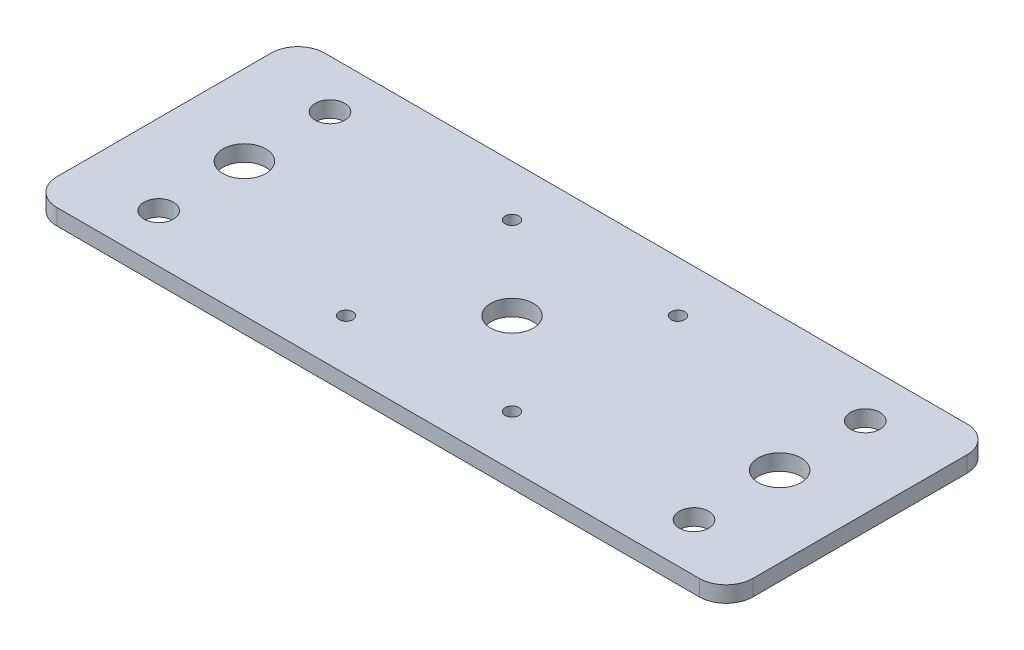
ISO-10303-21;
HEADER;
FILE_DESCRIPTION(('STEP AP214'),'2;1');
FILE_NAME('part.step','',(''),(''),'','','');
FILE_SCHEMA(('AUTOMOTIVE_DESIGN { 1 0 10303 214 1 1 1 1 }'));
ENDSEC;
DATA;
#1=APPLICATION_CONTEXT('core data for automotive mechanical design processes');
#2=APPLICATION_PROTOCOL_DEFINITION('international standard','automotive_design',2000,#1);
#3=PRODUCT_CONTEXT('',#1,'mechanical');
#4=PRODUCT('Part','Part','',(#3));
#5=PRODUCT_RELATED_PRODUCT_CATEGORY('part','',(#4));
#6=PRODUCT_DEFINITION_FORMATION('','',#4);
#7=PRODUCT_DEFINITION_CONTEXT('part definition',#1,'design');
#8=PRODUCT_DEFINITION('design','',#6,#7);
#9=PRODUCT_DEFINITION_SHAPE('','',#8);
#10=(LENGTH_UNIT() NAMED_UNIT(*) SI_UNIT(.MILLI.,.METRE.));
#11=(NAMED_UNIT(*) PLANE_ANGLE_UNIT() SI_UNIT($,.RADIAN.));
#12=(NAMED_UNIT(*) SI_UNIT($,.STERADIAN.) SOLID_ANGLE_UNIT());
#13=UNCERTAINTY_MEASURE_WITH_UNIT(LENGTH_MEASURE(1.E-05),#10,'distance_accuracy_value','');
#14=(GEOMETRIC_REPRESENTATION_CONTEXT(3) GLOBAL_UNCERTAINTY_ASSIGNED_CONTEXT((#13)) GLOBAL_UNIT_ASSIGNED_CONTEXT((#10,
#11,#12)) REPRESENTATION_CONTEXT('',''));
#15=CARTESIAN_POINT('',(0.,0.,0.));
#16=DIRECTION('',(0.,0.,1.));
#17=DIRECTION('',(1.,0.,0.));
#18=AXIS2_PLACEMENT_3D('',#15,#16,#17);
#19=CARTESIAN_POINT('',(-60.,3.,-20.));
#20=DIRECTION('',(0.,-1.,0.));
#21=DIRECTION('',(0.,0.,-1.));
#22=AXIS2_PLACEMENT_3D('',#19,#20,#21);
#23=CYLINDRICAL_SURFACE('',#22,5.);
#24=CARTESIAN_POINT('',(-60.,0.,-20.));
#25=DIRECTION('',(0.,1.,0.));
#26=DIRECTION('',(0.,0.,1.));
#27=AXIS2_PLACEMENT_3D('',#24,#25,#26);
#28=CIRCLE('',#27,5.);
#29=CARTESIAN_POINT('',(-65.,0.,-20.));
#30=VERTEX_POINT('',#29);
#31=CARTESIAN_POINT('',(-60.,0.,-25.));
#32=VERTEX_POINT('',#31);
#33=EDGE_CURVE('E166',#30,#32,#28,.F.);
#34=ORIENTED_EDGE('',*,*,#33,.F.);
#35=DIRECTION('',(0.,-1.,0.));
#36=VECTOR('',#35,1.);
#37=CARTESIAN_POINT('',(-65.,3.,-20.));
#38=LINE('',#37,#36);
#39=CARTESIAN_POINT('',(-65.,3.,-20.));
#40=VERTEX_POINT('',#39);
#41=EDGE_CURVE('E11',#40,#30,#38,.T.);
#42=ORIENTED_EDGE('',*,*,#41,.F.);
#43=CARTESIAN_POINT('',(-60.,3.,-20.));
#44=DIRECTION('',(0.,1.,0.));
#45=DIRECTION('',(0.,0.,1.));
#46=AXIS2_PLACEMENT_3D('',#43,#44,#45);
#47=CIRCLE('',#46,5.);
#48=CARTESIAN_POINT('',(-60.,3.,-25.));
#49=VERTEX_POINT('',#48);
#50=EDGE_CURVE('E219',#40,#49,#47,.F.);
#51=ORIENTED_EDGE('',*,*,#50,.T.);
#52=DIRECTION('',(0.,-1.,0.));
#53=VECTOR('',#52,1.);
#54=CARTESIAN_POINT('',(-60.,3.,-25.));
#55=LINE('',#54,#53);
#56=EDGE_CURVE('E53',#49,#32,#55,.T.);
#57=ORIENTED_EDGE('',*,*,#56,.T.);
#58=EDGE_LOOP('',(#34,#42,#51,#57));
#59=FACE_BOUND('',#58,.T.);
#60=ADVANCED_FACE('F37',(#59),#23,.T.);
#61=CARTESIAN_POINT('',(-65.,3.,0.));
#62=DIRECTION('',(-1.,0.,0.));
#63=DIRECTION('',(0.,0.,1.));
#64=AXIS2_PLACEMENT_3D('',#61,#62,#63);
#65=PLANE('',#64);
#66=DIRECTION('',(0.,0.,-1.));
#67=VECTOR('',#66,1.);
#68=CARTESIAN_POINT('',(-65.,0.,0.));
#69=LINE('',#68,#67);
#70=CARTESIAN_POINT('',(-65.,0.,20.));
#71=VERTEX_POINT('',#70);
#72=EDGE_CURVE('E168',#71,#30,#69,.T.);
#73=ORIENTED_EDGE('',*,*,#72,.F.);
#74=DIRECTION('',(0.,-1.,0.));
#75=VECTOR('',#74,1.);
#76=CARTESIAN_POINT('',(-65.,3.,20.));
#77=LINE('',#76,#75);
#78=CARTESIAN_POINT('',(-65.,3.,20.));
#79=VERTEX_POINT('',#78);
#80=EDGE_CURVE('E45',#79,#71,#77,.T.);
#81=ORIENTED_EDGE('',*,*,#80,.F.);
#82=DIRECTION('',(0.,0.,-1.));
#83=VECTOR('',#82,1.);
#84=CARTESIAN_POINT('',(-65.,3.,0.));
#85=LINE('',#84,#83);
#86=EDGE_CURVE('E245',#79,#40,#85,.T.);
#87=ORIENTED_EDGE('',*,*,#86,.T.);
#88=ORIENTED_EDGE('',*,*,#41,.T.);
#89=EDGE_LOOP('',(#73,#81,#87,#88));
#90=FACE_BOUND('',#89,.T.);
#91=ADVANCED_FACE('F236',(#90),#65,.T.);
#92=CARTESIAN_POINT('',(-60.,3.,20.));
#93=DIRECTION('',(0.,-1.,0.));
#94=DIRECTION('',(0.,0.,-1.));
#95=AXIS2_PLACEMENT_3D('',#92,#93,#94);
#96=CYLINDRICAL_SURFACE('',#95,5.);
#97=CARTESIAN_POINT('',(-60.,0.,20.));
#98=DIRECTION('',(0.,1.,0.));
#99=DIRECTION('',(0.,0.,1.));
#100=AXIS2_PLACEMENT_3D('',#97,#98,#99);
#101=CIRCLE('',#100,5.);
#102=CARTESIAN_POINT('',(-60.,0.,25.));
#103=VERTEX_POINT('',#102);
#104=EDGE_CURVE('E171',#103,#71,#101,.F.);
#105=ORIENTED_EDGE('',*,*,#104,.F.);
#106=DIRECTION('',(0.,-1.,0.));
#107=VECTOR('',#106,1.);
#108=CARTESIAN_POINT('',(-60.,3.,25.));
#109=LINE('',#108,#107);
#110=CARTESIAN_POINT('',(-60.,3.,25.));
#111=VERTEX_POINT('',#110);
#112=EDGE_CURVE('E225',#111,#103,#109,.T.);
#113=ORIENTED_EDGE('',*,*,#112,.F.);
#114=CARTESIAN_POINT('',(-60.,3.,20.));
#115=DIRECTION('',(0.,1.,0.));
#116=DIRECTION('',(0.,0.,1.));
#117=AXIS2_PLACEMENT_3D('',#114,#115,#116);
#118=CIRCLE('',#117,5.);
#119=EDGE_CURVE('E232',#111,#79,#118,.F.);
#120=ORIENTED_EDGE('',*,*,#119,.T.);
#121=ORIENTED_EDGE('',*,*,#80,.T.);
#122=EDGE_LOOP('',(#105,#113,#120,#121));
#123=FACE_BOUND('',#122,.T.);
#124=ADVANCED_FACE('F230',(#123),#96,.T.);
#125=CARTESIAN_POINT('',(0.,3.,25.));
#126=DIRECTION('',(0.,0.,1.));
#127=DIRECTION('',(1.,0.,0.));
#128=AXIS2_PLACEMENT_3D('',#125,#126,#127);
#129=PLANE('',#128);
#130=DIRECTION('',(-1.,0.,0.));
#131=VECTOR('',#130,1.);
#132=CARTESIAN_POINT('',(0.,0.,25.));
#133=LINE('',#132,#131);
#134=CARTESIAN_POINT('',(60.,0.,25.));
#135=VERTEX_POINT('',#134);
#136=EDGE_CURVE('E174',#135,#103,#133,.T.);
#137=ORIENTED_EDGE('',*,*,#136,.F.);
#138=DIRECTION('',(0.,-1.,0.));
#139=VECTOR('',#138,1.);
#140=CARTESIAN_POINT('',(60.,3.,25.));
#141=LINE('',#140,#139);
#142=CARTESIAN_POINT('',(60.,3.,25.));
#143=VERTEX_POINT('',#142);
#144=EDGE_CURVE('E223',#143,#135,#141,.T.);
#145=ORIENTED_EDGE('',*,*,#144,.F.);
#146=DIRECTION('',(-1.,0.,0.));
#147=VECTOR('',#146,1.);
#148=CARTESIAN_POINT('',(0.,3.,25.));
#149=LINE('',#148,#147);
#150=EDGE_CURVE('E128',#143,#111,#149,.T.);
#151=ORIENTED_EDGE('',*,*,#150,.T.);
#152=ORIENTED_EDGE('',*,*,#112,.T.);
#153=EDGE_LOOP('',(#137,#145,#151,#152));
#154=FACE_BOUND('',#153,.T.);
#155=ADVANCED_FACE('F243',(#154),#129,.T.);
#156=CARTESIAN_POINT('',(60.,3.,20.));
#157=DIRECTION('',(0.,-1.,0.));
#158=DIRECTION('',(0.,0.,-1.));
#159=AXIS2_PLACEMENT_3D('',#156,#157,#158);
#160=CYLINDRICAL_SURFACE('',#159,5.);
#161=CARTESIAN_POINT('',(60.,0.,20.));
#162=DIRECTION('',(0.,1.,0.));
#163=DIRECTION('',(0.,0.,1.));
#164=AXIS2_PLACEMENT_3D('',#161,#162,#163);
#165=CIRCLE('',#164,5.);
#166=CARTESIAN_POINT('',(65.,0.,20.));
#167=VERTEX_POINT('',#166);
#168=EDGE_CURVE('E177',#135,#167,#165,.T.);
#169=ORIENTED_EDGE('',*,*,#168,.T.);
#170=DIRECTION('',(0.,-1.,0.));
#171=VECTOR('',#170,1.);
#172=CARTESIAN_POINT('',(65.,3.,20.));
#173=LINE('',#172,#171);
#174=CARTESIAN_POINT('',(65.,3.,20.));
#175=VERTEX_POINT('',#174);
#176=EDGE_CURVE('E113',#175,#167,#173,.T.);
#177=ORIENTED_EDGE('',*,*,#176,.F.);
#178=CARTESIAN_POINT('',(60.,3.,20.));
#179=DIRECTION('',(0.,1.,0.));
#180=DIRECTION('',(0.,0.,1.));
#181=AXIS2_PLACEMENT_3D('',#178,#179,#180);
#182=CIRCLE('',#181,5.);
#183=EDGE_CURVE('E125',#143,#175,#182,.T.);
#184=ORIENTED_EDGE('',*,*,#183,.F.);
#185=ORIENTED_EDGE('',*,*,#144,.T.);
#186=EDGE_LOOP('',(#169,#177,#184,#185));
#187=FACE_BOUND('',#186,.T.);
#188=ADVANCED_FACE('F275',(#187),#160,.T.);
#189=CARTESIAN_POINT('',(65.,3.,0.));
#190=DIRECTION('',(1.,0.,0.));
#191=DIRECTION('',(0.,0.,-1.));
#192=AXIS2_PLACEMENT_3D('',#189,#190,#191);
#193=PLANE('',#192);
#194=DIRECTION('',(0.,0.,1.));
#195=VECTOR('',#194,1.);
#196=CARTESIAN_POINT('',(65.,0.,0.));
#197=LINE('',#196,#195);
#198=CARTESIAN_POINT('',(65.,0.,-20.));
#199=VERTEX_POINT('',#198);
#200=EDGE_CURVE('E110',#199,#167,#197,.T.);
#201=ORIENTED_EDGE('',*,*,#200,.F.);
#202=DIRECTION('',(0.,-1.,0.));
#203=VECTOR('',#202,1.);
#204=CARTESIAN_POINT('',(65.,3.,-20.));
#205=LINE('',#204,#203);
#206=CARTESIAN_POINT('',(65.,3.,-20.));
#207=VERTEX_POINT('',#206);
#208=EDGE_CURVE('E104',#207,#199,#205,.T.);
#209=ORIENTED_EDGE('',*,*,#208,.F.);
#210=DIRECTION('',(0.,0.,1.));
#211=VECTOR('',#210,1.);
#212=CARTESIAN_POINT('',(65.,3.,0.));
#213=LINE('',#212,#211);
#214=EDGE_CURVE('E108',#207,#175,#213,.T.);
#215=ORIENTED_EDGE('',*,*,#214,.T.);
#216=ORIENTED_EDGE('',*,*,#176,.T.);
#217=EDGE_LOOP('',(#201,#209,#215,#216));
#218=FACE_BOUND('',#217,.T.);
#219=ADVANCED_FACE('F106',(#218),#193,.T.);
#220=CARTESIAN_POINT('',(60.,3.,-20.));
#221=DIRECTION('',(0.,-1.,0.));
#222=DIRECTION('',(0.,0.,-1.));
#223=AXIS2_PLACEMENT_3D('',#220,#221,#222);
#224=CYLINDRICAL_SURFACE('',#223,5.);
#225=CARTESIAN_POINT('',(60.,0.,-20.));
#226=DIRECTION('',(0.,1.,0.));
#227=DIRECTION('',(0.,0.,1.));
#228=AXIS2_PLACEMENT_3D('',#225,#226,#227);
#229=CIRCLE('',#228,5.);
#230=CARTESIAN_POINT('',(60.,0.,-25.));
#231=VERTEX_POINT('',#230);
#232=EDGE_CURVE('E181',#199,#231,#229,.T.);
#233=ORIENTED_EDGE('',*,*,#232,.T.);
#234=DIRECTION('',(0.,-1.,0.));
#235=VECTOR('',#234,1.);
#236=CARTESIAN_POINT('',(60.,3.,-25.));
#237=LINE('',#236,#235);
#238=CARTESIAN_POINT('',(60.,3.,-25.));
#239=VERTEX_POINT('',#238);
#240=EDGE_CURVE('E79',#239,#231,#237,.T.);
#241=ORIENTED_EDGE('',*,*,#240,.F.);
#242=CARTESIAN_POINT('',(60.,3.,-20.));
#243=DIRECTION('',(0.,1.,0.));
#244=DIRECTION('',(0.,0.,1.));
#245=AXIS2_PLACEMENT_3D('',#242,#243,#244);
#246=CIRCLE('',#245,5.);
#247=EDGE_CURVE('E115',#207,#239,#246,.T.);
#248=ORIENTED_EDGE('',*,*,#247,.F.);
#249=ORIENTED_EDGE('',*,*,#208,.T.);
#250=EDGE_LOOP('',(#233,#241,#248,#249));
#251=FACE_BOUND('',#250,.T.);
#252=ADVANCED_FACE('F116',(#251),#224,.T.);
#253=CARTESIAN_POINT('',(-50.,3.,16.));
#254=DIRECTION('',(0.,-1.,0.));
#255=DIRECTION('',(0.,0.,-1.));
#256=AXIS2_PLACEMENT_3D('',#253,#254,#255);
#257=CYLINDRICAL_SURFACE('',#256,2.74999999999999);
#258=CARTESIAN_POINT('',(-50.,3.,16.));
#259=DIRECTION('',(0.,1.,0.));
#260=DIRECTION('',(0.,0.,1.));
#261=AXIS2_PLACEMENT_3D('',#258,#259,#260);
#262=CIRCLE('',#261,2.74999999999999);
#263=CARTESIAN_POINT('',(-50.,3.,18.75));
#264=VERTEX_POINT('',#263);
#265=EDGE_CURVE('E160',#264,#264,#262,.F.);
#266=ORIENTED_EDGE('',*,*,#265,.F.);
#267=EDGE_LOOP('',(#266));
#268=FACE_BOUND('',#267,.T.);
#269=CARTESIAN_POINT('',(-50.,0.,16.));
#270=DIRECTION('',(0.,1.,0.));
#271=DIRECTION('',(0.,0.,1.));
#272=AXIS2_PLACEMENT_3D('',#269,#270,#271);
#273=CIRCLE('',#272,2.74999999999999);
#274=CARTESIAN_POINT('',(-50.,0.,18.75));
#275=VERTEX_POINT('',#274);
#276=EDGE_CURVE('E213',#275,#275,#273,.F.);
#277=ORIENTED_EDGE('',*,*,#276,.T.);
#278=EDGE_LOOP('',(#277));
#279=FACE_BOUND('',#278,.T.);
#280=ADVANCED_FACE('F281',(#268,#279),#257,.F.);
#281=CARTESIAN_POINT('',(50.,3.,16.));
#282=DIRECTION('',(0.,-1.,0.));
#283=DIRECTION('',(0.,0.,-1.));
#284=AXIS2_PLACEMENT_3D('',#281,#282,#283);
#285=CYLINDRICAL_SURFACE('',#284,2.74999999999999);
#286=CARTESIAN_POINT('',(50.,3.,16.));
#287=DIRECTION('',(0.,1.,0.));
#288=DIRECTION('',(0.,0.,1.));
#289=AXIS2_PLACEMENT_3D('',#286,#287,#288);
#290=CIRCLE('',#289,2.74999999999999);
#291=CARTESIAN_POINT('',(50.,3.,18.75));
#292=VERTEX_POINT('',#291);
#293=EDGE_CURVE('E157',#292,#292,#290,.T.);
#294=ORIENTED_EDGE('',*,*,#293,.T.);
#295=EDGE_LOOP('',(#294));
#296=FACE_BOUND('',#295,.T.);
#297=CARTESIAN_POINT('',(50.,0.,16.));
#298=DIRECTION('',(0.,1.,0.));
#299=DIRECTION('',(0.,0.,1.));
#300=AXIS2_PLACEMENT_3D('',#297,#298,#299);
#301=CIRCLE('',#300,2.74999999999999);
#302=CARTESIAN_POINT('',(50.,0.,18.75));
#303=VERTEX_POINT('',#302);
#304=EDGE_CURVE('E210',#303,#303,#301,.T.);
#305=ORIENTED_EDGE('',*,*,#304,.F.);
#306=EDGE_LOOP('',(#305));
#307=FACE_BOUND('',#306,.T.);
#308=ADVANCED_FACE('F285',(#296,#307),#285,.F.);
#309=CARTESIAN_POINT('',(50.,3.,-16.));
#310=DIRECTION('',(0.,-1.,0.));
#311=DIRECTION('',(0.,0.,-1.));
#312=AXIS2_PLACEMENT_3D('',#309,#310,#311);
#313=CYLINDRICAL_SURFACE('',#312,2.75);
#314=CARTESIAN_POINT('',(50.,3.,-16.));
#315=DIRECTION('',(0.,1.,0.));
#316=DIRECTION('',(0.,0.,1.));
#317=AXIS2_PLACEMENT_3D('',#314,#315,#316);
#318=CIRCLE('',#317,2.75);
#319=CARTESIAN_POINT('',(50.,3.,-13.25));
#320=VERTEX_POINT('',#319);
#321=EDGE_CURVE('E154',#320,#320,#318,.T.);
#322=ORIENTED_EDGE('',*,*,#321,.T.);
#323=EDGE_LOOP('',(#322));
#324=FACE_BOUND('',#323,.T.);
#325=CARTESIAN_POINT('',(50.,0.,-16.));
#326=DIRECTION('',(0.,1.,0.));
#327=DIRECTION('',(0.,0.,1.));
#328=AXIS2_PLACEMENT_3D('',#325,#326,#327);
#329=CIRCLE('',#328,2.75);
#330=CARTESIAN_POINT('',(50.,0.,-13.25));
#331=VERTEX_POINT('',#330);
#332=EDGE_CURVE('E207',#331,#331,#329,.T.);
#333=ORIENTED_EDGE('',*,*,#332,.F.);
#334=EDGE_LOOP('',(#333));
#335=FACE_BOUND('',#334,.T.);
#336=ADVANCED_FACE('F291',(#324,#335),#313,.F.);
#337=CARTESIAN_POINT('',(50.,3.,0.));
#338=DIRECTION('',(0.,-1.,0.));
#339=DIRECTION('',(0.,0.,-1.));
#340=AXIS2_PLACEMENT_3D('',#337,#338,#339);
#341=CYLINDRICAL_SURFACE('',#340,4.00000000000001);
#342=CARTESIAN_POINT('',(50.,3.,0.));
#343=DIRECTION('',(0.,1.,0.));
#344=DIRECTION('',(0.,0.,1.));
#345=AXIS2_PLACEMENT_3D('',#342,#343,#344);
#346=CIRCLE('',#345,4.00000000000001);
#347=CARTESIAN_POINT('',(50.,3.,4.00000000000001));
#348=VERTEX_POINT('',#347);
#349=EDGE_CURVE('E151',#348,#348,#346,.T.);
#350=ORIENTED_EDGE('',*,*,#349,.T.);
#351=EDGE_LOOP('',(#350));
#352=FACE_BOUND('',#351,.T.);
#353=CARTESIAN_POINT('',(50.,0.,0.));
#354=DIRECTION('',(0.,1.,0.));
#355=DIRECTION('',(0.,0.,1.));
#356=AXIS2_PLACEMENT_3D('',#353,#354,#355);
#357=CIRCLE('',#356,4.00000000000001);
#358=CARTESIAN_POINT('',(50.,0.,4.00000000000001));
#359=VERTEX_POINT('',#358);
#360=EDGE_CURVE('E204',#359,#359,#357,.T.);
#361=ORIENTED_EDGE('',*,*,#360,.F.);
#362=EDGE_LOOP('',(#361));
#363=FACE_BOUND('',#362,.T.);
#364=ADVANCED_FACE('F300',(#352,#363),#341,.F.);
#365=CARTESIAN_POINT('',(-15.4999999999996,3.,-15.4999999999983));
#366=DIRECTION('',(0.,-1.,0.));
#367=DIRECTION('',(0.,0.,-1.));
#368=AXIS2_PLACEMENT_3D('',#365,#366,#367);
#369=CYLINDRICAL_SURFACE('',#368,1.28355817354355);
#370=CARTESIAN_POINT('',(-15.4999999999996,3.,-15.4999999999983));
#371=DIRECTION('',(0.,1.,0.));
#372=DIRECTION('',(0.,0.,1.));
#373=AXIS2_PLACEMENT_3D('',#370,#371,#372);
#374=CIRCLE('',#373,1.28355817354355);
#375=CARTESIAN_POINT('',(-15.4999999999996,3.,-14.2164418264547));
#376=VERTEX_POINT('',#375);
#377=EDGE_CURVE('E148',#376,#376,#374,.T.);
#378=ORIENTED_EDGE('',*,*,#377,.T.);
#379=EDGE_LOOP('',(#378));
#380=FACE_BOUND('',#379,.T.);
#381=CARTESIAN_POINT('',(-15.4999999999996,0.,-15.4999999999983));
#382=DIRECTION('',(0.,1.,0.));
#383=DIRECTION('',(0.,0.,1.));
#384=AXIS2_PLACEMENT_3D('',#381,#382,#383);
#385=CIRCLE('',#384,1.28355817354355);
#386=CARTESIAN_POINT('',(-15.4999999999996,0.,-14.2164418264547));
#387=VERTEX_POINT('',#386);
#388=EDGE_CURVE('E201',#387,#387,#385,.T.);
#389=ORIENTED_EDGE('',*,*,#388,.F.);
#390=EDGE_LOOP('',(#389));
#391=FACE_BOUND('',#390,.T.);
#392=ADVANCED_FACE('F304',(#380,#391),#369,.F.);
#393=CARTESIAN_POINT('',(-15.4999999999978,3.,15.5000000000013));
#394=DIRECTION('',(0.,-1.,0.));
#395=DIRECTION('',(0.,0.,-1.));
#396=AXIS2_PLACEMENT_3D('',#393,#394,#395);
#397=CYLINDRICAL_SURFACE('',#396,1.28355817354343);
#398=CARTESIAN_POINT('',(-15.4999999999978,3.,15.5000000000013));
#399=DIRECTION('',(0.,1.,0.));
#400=DIRECTION('',(0.,0.,1.));
#401=AXIS2_PLACEMENT_3D('',#398,#399,#400);
#402=CIRCLE('',#401,1.28355817354343);
#403=CARTESIAN_POINT('',(-15.4999999999978,3.,16.7835581735447));
#404=VERTEX_POINT('',#403);
#405=EDGE_CURVE('E145',#404,#404,#402,.T.);
#406=ORIENTED_EDGE('',*,*,#405,.T.);
#407=EDGE_LOOP('',(#406));
#408=FACE_BOUND('',#407,.T.);
#409=CARTESIAN_POINT('',(-15.4999999999978,0.,15.5000000000013));
#410=DIRECTION('',(0.,1.,0.));
#411=DIRECTION('',(0.,0.,1.));
#412=AXIS2_PLACEMENT_3D('',#409,#410,#411);
#413=CIRCLE('',#412,1.28355817354343);
#414=CARTESIAN_POINT('',(-15.4999999999978,0.,16.7835581735447));
#415=VERTEX_POINT('',#414);
#416=EDGE_CURVE('E198',#415,#415,#413,.T.);
#417=ORIENTED_EDGE('',*,*,#416,.F.);
#418=EDGE_LOOP('',(#417));
#419=FACE_BOUND('',#418,.T.);
#420=ADVANCED_FACE('F308',(#408,#419),#397,.F.);
#421=CARTESIAN_POINT('',(15.5000000000017,3.,15.4999999999996));
#422=DIRECTION('',(0.,-1.,0.));
#423=DIRECTION('',(0.,0.,-1.));
#424=AXIS2_PLACEMENT_3D('',#421,#422,#423);
#425=CYLINDRICAL_SURFACE('',#424,1.28355817354161);
#426=CARTESIAN_POINT('',(15.5000000000017,3.,15.4999999999996));
#427=DIRECTION('',(0.,1.,0.));
#428=DIRECTION('',(0.,0.,1.));
#429=AXIS2_PLACEMENT_3D('',#426,#427,#428);
#430=CIRCLE('',#429,1.28355817354161);
#431=CARTESIAN_POINT('',(15.5000000000017,3.,16.7835581735412));
#432=VERTEX_POINT('',#431);
#433=EDGE_CURVE('E142',#432,#432,#430,.T.);
#434=ORIENTED_EDGE('',*,*,#433,.T.);
#435=EDGE_LOOP('',(#434));
#436=FACE_BOUND('',#435,.T.);
#437=CARTESIAN_POINT('',(15.5000000000017,0.,15.4999999999996));
#438=DIRECTION('',(0.,1.,0.));
#439=DIRECTION('',(0.,0.,1.));
#440=AXIS2_PLACEMENT_3D('',#437,#438,#439);
#441=CIRCLE('',#440,1.28355817354161);
#442=CARTESIAN_POINT('',(15.5000000000017,0.,16.7835581735412));
#443=VERTEX_POINT('',#442);
#444=EDGE_CURVE('E195',#443,#443,#441,.T.);
#445=ORIENTED_EDGE('',*,*,#444,.F.);
#446=EDGE_LOOP('',(#445));
#447=FACE_BOUND('',#446,.T.);
#448=ADVANCED_FACE('F312',(#436,#447),#425,.F.);
#449=CARTESIAN_POINT('',(15.5,3.,-15.5));
#450=DIRECTION('',(0.,-1.,0.));
#451=DIRECTION('',(0.,0.,-1.));
#452=AXIS2_PLACEMENT_3D('',#449,#450,#451);
#453=CYLINDRICAL_SURFACE('',#452,1.28355817354166);
#454=CARTESIAN_POINT('',(15.5,3.,-15.5));
#455=DIRECTION('',(0.,1.,0.));
#456=DIRECTION('',(0.,0.,1.));
#457=AXIS2_PLACEMENT_3D('',#454,#455,#456);
#458=CIRCLE('',#457,1.28355817354166);
#459=CARTESIAN_POINT('',(15.5,3.,-14.2164418264583));
#460=VERTEX_POINT('',#459);
#461=EDGE_CURVE('E139',#460,#460,#458,.T.);
#462=ORIENTED_EDGE('',*,*,#461,.T.);
#463=EDGE_LOOP('',(#462));
#464=FACE_BOUND('',#463,.T.);
#465=CARTESIAN_POINT('',(15.5,0.,-15.5));
#466=DIRECTION('',(0.,1.,0.));
#467=DIRECTION('',(0.,0.,1.));
#468=AXIS2_PLACEMENT_3D('',#465,#466,#467);
#469=CIRCLE('',#468,1.28355817354166);
#470=CARTESIAN_POINT('',(15.5,0.,-14.2164418264583));
#471=VERTEX_POINT('',#470);
#472=EDGE_CURVE('E192',#471,#471,#469,.T.);
#473=ORIENTED_EDGE('',*,*,#472,.F.);
#474=EDGE_LOOP('',(#473));
#475=FACE_BOUND('',#474,.T.);
#476=ADVANCED_FACE('F316',(#464,#475),#453,.F.);
#477=CARTESIAN_POINT('',(0.,3.,0.));
#478=DIRECTION('',(0.,-1.,0.));
#479=DIRECTION('',(0.,0.,-1.));
#480=AXIS2_PLACEMENT_3D('',#477,#478,#479);
#481=CYLINDRICAL_SURFACE('',#480,4.);
#482=CARTESIAN_POINT('',(0.,3.,0.));
#483=DIRECTION('',(0.,1.,0.));
#484=DIRECTION('',(0.,0.,1.));
#485=AXIS2_PLACEMENT_3D('',#482,#483,#484);
#486=CIRCLE('',#485,4.);
#487=CARTESIAN_POINT('',(0.,3.,4.));
#488=VERTEX_POINT('',#487);
#489=EDGE_CURVE('E136',#488,#488,#486,.T.);
#490=ORIENTED_EDGE('',*,*,#489,.T.);
#491=EDGE_LOOP('',(#490));
#492=FACE_BOUND('',#491,.T.);
#493=CARTESIAN_POINT('',(0.,0.,0.));
#494=DIRECTION('',(0.,1.,0.));
#495=DIRECTION('',(0.,0.,1.));
#496=AXIS2_PLACEMENT_3D('',#493,#494,#495);
#497=CIRCLE('',#496,4.);
#498=CARTESIAN_POINT('',(0.,0.,4.));
#499=VERTEX_POINT('',#498);
#500=EDGE_CURVE('E189',#499,#499,#497,.T.);
#501=ORIENTED_EDGE('',*,*,#500,.F.);
#502=EDGE_LOOP('',(#501));
#503=FACE_BOUND('',#502,.T.);
#504=ADVANCED_FACE('F260',(#492,#503),#481,.F.);
#505=CARTESIAN_POINT('',(-50.,3.,-16.));
#506=DIRECTION('',(0.,-1.,0.));
#507=DIRECTION('',(0.,0.,-1.));
#508=AXIS2_PLACEMENT_3D('',#505,#506,#507);
#509=CYLINDRICAL_SURFACE('',#508,2.75);
#510=CARTESIAN_POINT('',(-50.,3.,-16.));
#511=DIRECTION('',(0.,1.,0.));
#512=DIRECTION('',(0.,0.,1.));
#513=AXIS2_PLACEMENT_3D('',#510,#511,#512);
#514=CIRCLE('',#513,2.75);
#515=CARTESIAN_POINT('',(-50.,3.,-13.25));
#516=VERTEX_POINT('',#515);
#517=EDGE_CURVE('E133',#516,#516,#514,.F.);
#518=ORIENTED_EDGE('',*,*,#517,.F.);
#519=EDGE_LOOP('',(#518));
#520=FACE_BOUND('',#519,.T.);
#521=CARTESIAN_POINT('',(-50.,0.,-16.));
#522=DIRECTION('',(0.,1.,0.));
#523=DIRECTION('',(0.,0.,1.));
#524=AXIS2_PLACEMENT_3D('',#521,#522,#523);
#525=CIRCLE('',#524,2.75);
#526=CARTESIAN_POINT('',(-50.,0.,-13.25));
#527=VERTEX_POINT('',#526);
#528=EDGE_CURVE('E186',#527,#527,#525,.F.);
#529=ORIENTED_EDGE('',*,*,#528,.T.);
#530=EDGE_LOOP('',(#529));
#531=FACE_BOUND('',#530,.T.);
#532=ADVANCED_FACE('F252',(#520,#531),#509,.F.);
#533=CARTESIAN_POINT('',(0.,3.,-25.));
#534=DIRECTION('',(0.,0.,-1.));
#535=DIRECTION('',(-1.,0.,0.));
#536=AXIS2_PLACEMENT_3D('',#533,#534,#535);
#537=PLANE('',#536);
#538=DIRECTION('',(1.,0.,0.));
#539=VECTOR('',#538,1.);
#540=CARTESIAN_POINT('',(0.,0.,-25.));
#541=LINE('',#540,#539);
#542=EDGE_CURVE('E183',#32,#231,#541,.T.);
#543=ORIENTED_EDGE('',*,*,#542,.F.);
#544=ORIENTED_EDGE('',*,*,#56,.F.);
#545=DIRECTION('',(1.,0.,0.));
#546=VECTOR('',#545,1.);
#547=CARTESIAN_POINT('',(0.,3.,-25.));
#548=LINE('',#547,#546);
#549=EDGE_CURVE('E119',#49,#239,#548,.T.);
#550=ORIENTED_EDGE('',*,*,#549,.T.);
#551=ORIENTED_EDGE('',*,*,#240,.T.);
#552=EDGE_LOOP('',(#543,#544,#550,#551));
#553=FACE_BOUND('',#552,.T.);
#554=ADVANCED_FACE('F249',(#553),#537,.T.);
#555=CARTESIAN_POINT('',(-50.,3.,0.));
#556=DIRECTION('',(0.,-1.,0.));
#557=DIRECTION('',(0.,0.,-1.));
#558=AXIS2_PLACEMENT_3D('',#555,#556,#557);
#559=CYLINDRICAL_SURFACE('',#558,4.00000000000001);
#560=CARTESIAN_POINT('',(-50.,3.,0.));
#561=DIRECTION('',(0.,1.,0.));
#562=DIRECTION('',(0.,0.,1.));
#563=AXIS2_PLACEMENT_3D('',#560,#561,#562);
#564=CIRCLE('',#563,4.00000000000001);
#565=CARTESIAN_POINT('',(-50.,3.,4.00000000000001));
#566=VERTEX_POINT('',#565);
#567=EDGE_CURVE('E163',#566,#566,#564,.F.);
#568=ORIENTED_EDGE('',*,*,#567,.F.);
#569=EDGE_LOOP('',(#568));
#570=FACE_BOUND('',#569,.T.);
#571=CARTESIAN_POINT('',(-50.,0.,0.));
#572=DIRECTION('',(0.,1.,0.));
#573=DIRECTION('',(0.,0.,1.));
#574=AXIS2_PLACEMENT_3D('',#571,#572,#573);
#575=CIRCLE('',#574,4.00000000000001);
#576=CARTESIAN_POINT('',(-50.,0.,4.00000000000001));
#577=VERTEX_POINT('',#576);
#578=EDGE_CURVE('E216',#577,#577,#575,.F.);
#579=ORIENTED_EDGE('',*,*,#578,.T.);
#580=EDGE_LOOP('',(#579));
#581=FACE_BOUND('',#580,.T.);
#582=ADVANCED_FACE('F251',(#570,#581),#559,.F.);
#583=CARTESIAN_POINT('',(0.,3.,0.));
#584=DIRECTION('',(0.,1.,0.));
#585=DIRECTION('',(0.,0.,1.));
#586=AXIS2_PLACEMENT_3D('',#583,#584,#585);
#587=PLANE('',#586);
#588=ORIENTED_EDGE('',*,*,#50,.F.);
#589=ORIENTED_EDGE('',*,*,#86,.F.);
#590=ORIENTED_EDGE('',*,*,#119,.F.);
#591=ORIENTED_EDGE('',*,*,#150,.F.);
#592=ORIENTED_EDGE('',*,*,#183,.T.);
#593=ORIENTED_EDGE('',*,*,#214,.F.);
#594=ORIENTED_EDGE('',*,*,#247,.T.);
#595=ORIENTED_EDGE('',*,*,#549,.F.);
#596=EDGE_LOOP('',(#588,#589,#590,#591,#592,#593,#594,#595));
#597=FACE_BOUND('',#596,.T.);
#598=ORIENTED_EDGE('',*,*,#517,.T.);
#599=EDGE_LOOP('',(#598));
#600=FACE_BOUND('',#599,.T.);
#601=ORIENTED_EDGE('',*,*,#489,.F.);
#602=EDGE_LOOP('',(#601));
#603=FACE_BOUND('',#602,.T.);
#604=ORIENTED_EDGE('',*,*,#461,.F.);
#605=EDGE_LOOP('',(#604));
#606=FACE_BOUND('',#605,.T.);
#607=ORIENTED_EDGE('',*,*,#433,.F.);
#608=EDGE_LOOP('',(#607));
#609=FACE_BOUND('',#608,.T.);
#610=ORIENTED_EDGE('',*,*,#405,.F.);
#611=EDGE_LOOP('',(#610));
#612=FACE_BOUND('',#611,.T.);
#613=ORIENTED_EDGE('',*,*,#377,.F.);
#614=EDGE_LOOP('',(#613));
#615=FACE_BOUND('',#614,.T.);
#616=ORIENTED_EDGE('',*,*,#349,.F.);
#617=EDGE_LOOP('',(#616));
#618=FACE_BOUND('',#617,.T.);
#619=ORIENTED_EDGE('',*,*,#321,.F.);
#620=EDGE_LOOP('',(#619));
#621=FACE_BOUND('',#620,.T.);
#622=ORIENTED_EDGE('',*,*,#293,.F.);
#623=EDGE_LOOP('',(#622));
#624=FACE_BOUND('',#623,.T.);
#625=ORIENTED_EDGE('',*,*,#265,.T.);
#626=EDGE_LOOP('',(#625));
#627=FACE_BOUND('',#626,.T.);
#628=ORIENTED_EDGE('',*,*,#567,.T.);
#629=EDGE_LOOP('',(#628));
#630=FACE_BOUND('',#629,.T.);
#631=ADVANCED_FACE('F121',(#597,#600,#603,#606,#609,#612,#615,#618,#621,#624,#627,#630),#587,.T.);
#632=CARTESIAN_POINT('',(0.,0.,0.));
#633=DIRECTION('',(0.,1.,0.));
#634=DIRECTION('',(0.,0.,1.));
#635=AXIS2_PLACEMENT_3D('',#632,#633,#634);
#636=PLANE('',#635);
#637=ORIENTED_EDGE('',*,*,#33,.T.);
#638=ORIENTED_EDGE('',*,*,#542,.T.);
#639=ORIENTED_EDGE('',*,*,#232,.F.);
#640=ORIENTED_EDGE('',*,*,#200,.T.);
#641=ORIENTED_EDGE('',*,*,#168,.F.);
#642=ORIENTED_EDGE('',*,*,#136,.T.);
#643=ORIENTED_EDGE('',*,*,#104,.T.);
#644=ORIENTED_EDGE('',*,*,#72,.T.);
#645=EDGE_LOOP('',(#637,#638,#639,#640,#641,#642,#643,#644));
#646=FACE_BOUND('',#645,.T.);
#647=ORIENTED_EDGE('',*,*,#528,.F.);
#648=EDGE_LOOP('',(#647));
#649=FACE_BOUND('',#648,.T.);
#650=ORIENTED_EDGE('',*,*,#500,.T.);
#651=EDGE_LOOP('',(#650));
#652=FACE_BOUND('',#651,.T.);
#653=ORIENTED_EDGE('',*,*,#472,.T.);
#654=EDGE_LOOP('',(#653));
#655=FACE_BOUND('',#654,.T.);
#656=ORIENTED_EDGE('',*,*,#444,.T.);
#657=EDGE_LOOP('',(#656));
#658=FACE_BOUND('',#657,.T.);
#659=ORIENTED_EDGE('',*,*,#416,.T.);
#660=EDGE_LOOP('',(#659));
#661=FACE_BOUND('',#660,.T.);
#662=ORIENTED_EDGE('',*,*,#388,.T.);
#663=EDGE_LOOP('',(#662));
#664=FACE_BOUND('',#663,.T.);
#665=ORIENTED_EDGE('',*,*,#360,.T.);
#666=EDGE_LOOP('',(#665));
#667=FACE_BOUND('',#666,.T.);
#668=ORIENTED_EDGE('',*,*,#332,.T.);
#669=EDGE_LOOP('',(#668));
#670=FACE_BOUND('',#669,.T.);
#671=ORIENTED_EDGE('',*,*,#304,.T.);
#672=EDGE_LOOP('',(#671));
#673=FACE_BOUND('',#672,.T.);
#674=ORIENTED_EDGE('',*,*,#276,.F.);
#675=EDGE_LOOP('',(#674));
#676=FACE_BOUND('',#675,.T.);
#677=ORIENTED_EDGE('',*,*,#578,.F.);
#678=EDGE_LOOP('',(#677));
#679=FACE_BOUND('',#678,.T.);
#680=ADVANCED_FACE('F238',(#646,#649,#652,#655,#658,#661,#664,#667,#670,#673,#676,#679),#636,.F.);
#681=CLOSED_SHELL('',(#60,#91,#124,#155,#188,#219,#252,#280,#308,#336,#364,#392,#420,#448,#476,
#504,#532,#554,#582,#631,#680));
#682=MANIFOLD_SOLID_BREP('B2',#681);
#683=ADVANCED_BREP_SHAPE_REPRESENTATION('',(#18,#682),#14);
#684=SHAPE_DEFINITION_REPRESENTATION(#9,#683);
ENDSEC;
END-ISO-10303-21;
